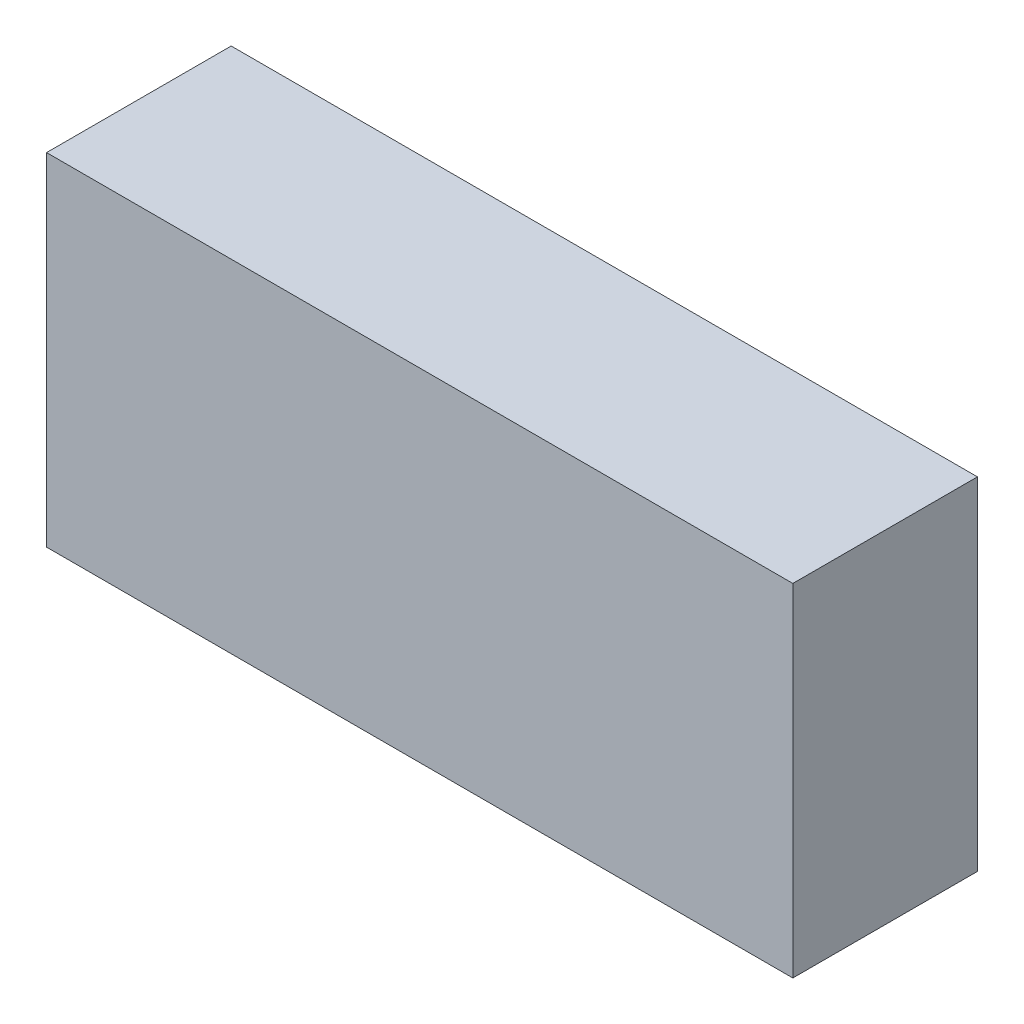
ISO-10303-21;
HEADER;
FILE_DESCRIPTION(('STEP AP214'),'2;1');
FILE_NAME('part.step','',(''),(''),'','','');
FILE_SCHEMA(('AUTOMOTIVE_DESIGN { 1 0 10303 214 1 1 1 1 }'));
ENDSEC;
DATA;
#1=APPLICATION_CONTEXT('core data for automotive mechanical design processes');
#2=APPLICATION_PROTOCOL_DEFINITION('international standard','automotive_design',2000,#1);
#3=PRODUCT_CONTEXT('',#1,'mechanical');
#4=PRODUCT('Part','Part','',(#3));
#5=PRODUCT_RELATED_PRODUCT_CATEGORY('part','',(#4));
#6=PRODUCT_DEFINITION_FORMATION('','',#4);
#7=PRODUCT_DEFINITION_CONTEXT('part definition',#1,'design');
#8=PRODUCT_DEFINITION('design','',#6,#7);
#9=PRODUCT_DEFINITION_SHAPE('','',#8);
#10=(LENGTH_UNIT() NAMED_UNIT(*) SI_UNIT(.MILLI.,.METRE.));
#11=(NAMED_UNIT(*) PLANE_ANGLE_UNIT() SI_UNIT($,.RADIAN.));
#12=(NAMED_UNIT(*) SI_UNIT($,.STERADIAN.) SOLID_ANGLE_UNIT());
#13=UNCERTAINTY_MEASURE_WITH_UNIT(LENGTH_MEASURE(1.E-05),#10,'distance_accuracy_value','');
#14=(GEOMETRIC_REPRESENTATION_CONTEXT(3) GLOBAL_UNCERTAINTY_ASSIGNED_CONTEXT((#13)) GLOBAL_UNIT_ASSIGNED_CONTEXT((#10,
#11,#12)) REPRESENTATION_CONTEXT('',''));
#15=CARTESIAN_POINT('',(0.,0.,0.));
#16=DIRECTION('',(0.,0.,1.));
#17=DIRECTION('',(1.,0.,0.));
#18=AXIS2_PLACEMENT_3D('',#15,#16,#17);
#19=CARTESIAN_POINT('',(47.5,43.5,-11.75));
#20=DIRECTION('',(-1.,0.,0.));
#21=DIRECTION('',(0.,0.,1.));
#22=AXIS2_PLACEMENT_3D('',#19,#20,#21);
#23=PLANE('',#22);
#24=DIRECTION('',(0.,0.,-1.));
#25=VECTOR('',#24,1.);
#26=CARTESIAN_POINT('',(47.5,0.,-11.75));
#27=LINE('',#26,#25);
#28=CARTESIAN_POINT('',(47.5,0.,11.75));
#29=VERTEX_POINT('',#28);
#30=CARTESIAN_POINT('',(47.5,0.,-11.75));
#31=VERTEX_POINT('',#30);
#32=EDGE_CURVE('E100',#29,#31,#27,.T.);
#33=ORIENTED_EDGE('',*,*,#32,.T.);
#34=DIRECTION('',(0.,-1.,0.));
#35=VECTOR('',#34,1.);
#36=CARTESIAN_POINT('',(47.5,43.5,-11.75));
#37=LINE('',#36,#35);
#38=CARTESIAN_POINT('',(47.5,43.5,-11.75));
#39=VERTEX_POINT('',#38);
#40=EDGE_CURVE('E11',#39,#31,#37,.T.);
#41=ORIENTED_EDGE('',*,*,#40,.F.);
#42=DIRECTION('',(0.,0.,-1.));
#43=VECTOR('',#42,1.);
#44=CARTESIAN_POINT('',(47.5,43.5,-11.75));
#45=LINE('',#44,#43);
#46=CARTESIAN_POINT('',(47.5,43.5,11.75));
#47=VERTEX_POINT('',#46);
#48=EDGE_CURVE('E88',#47,#39,#45,.T.);
#49=ORIENTED_EDGE('',*,*,#48,.F.);
#50=DIRECTION('',(0.,-1.,0.));
#51=VECTOR('',#50,1.);
#52=CARTESIAN_POINT('',(47.5,43.5,11.75));
#53=LINE('',#52,#51);
#54=EDGE_CURVE('E96',#47,#29,#53,.T.);
#55=ORIENTED_EDGE('',*,*,#54,.T.);
#56=EDGE_LOOP('',(#33,#41,#49,#55));
#57=FACE_BOUND('',#56,.T.);
#58=ADVANCED_FACE('F37',(#57),#23,.F.);
#59=CARTESIAN_POINT('',(-47.5,43.5,-11.75));
#60=DIRECTION('',(0.,0.,1.));
#61=DIRECTION('',(1.,0.,0.));
#62=AXIS2_PLACEMENT_3D('',#59,#60,#61);
#63=PLANE('',#62);
#64=DIRECTION('',(-1.,0.,0.));
#65=VECTOR('',#64,1.);
#66=CARTESIAN_POINT('',(-47.5,0.,-11.75));
#67=LINE('',#66,#65);
#68=CARTESIAN_POINT('',(-47.5,0.,-11.75));
#69=VERTEX_POINT('',#68);
#70=EDGE_CURVE('E92',#31,#69,#67,.T.);
#71=ORIENTED_EDGE('',*,*,#70,.T.);
#72=DIRECTION('',(0.,-1.,0.));
#73=VECTOR('',#72,1.);
#74=CARTESIAN_POINT('',(-47.5,43.5,-11.75));
#75=LINE('',#74,#73);
#76=CARTESIAN_POINT('',(-47.5,43.5,-11.75));
#77=VERTEX_POINT('',#76);
#78=EDGE_CURVE('E45',#77,#69,#75,.T.);
#79=ORIENTED_EDGE('',*,*,#78,.F.);
#80=DIRECTION('',(-1.,0.,0.));
#81=VECTOR('',#80,1.);
#82=CARTESIAN_POINT('',(-47.5,43.5,-11.75));
#83=LINE('',#82,#81);
#84=EDGE_CURVE('E83',#39,#77,#83,.T.);
#85=ORIENTED_EDGE('',*,*,#84,.F.);
#86=ORIENTED_EDGE('',*,*,#40,.T.);
#87=EDGE_LOOP('',(#71,#79,#85,#86));
#88=FACE_BOUND('',#87,.T.);
#89=ADVANCED_FACE('F91',(#88),#63,.F.);
#90=CARTESIAN_POINT('',(-47.5,43.5,-11.75));
#91=DIRECTION('',(1.,0.,0.));
#92=DIRECTION('',(0.,0.,-1.));
#93=AXIS2_PLACEMENT_3D('',#90,#91,#92);
#94=PLANE('',#93);
#95=DIRECTION('',(0.,0.,1.));
#96=VECTOR('',#95,1.);
#97=CARTESIAN_POINT('',(-47.5,0.,-11.75));
#98=LINE('',#97,#96);
#99=CARTESIAN_POINT('',(-47.5,0.,11.75));
#100=VERTEX_POINT('',#99);
#101=EDGE_CURVE('E70',#69,#100,#98,.T.);
#102=ORIENTED_EDGE('',*,*,#101,.T.);
#103=DIRECTION('',(0.,-1.,0.));
#104=VECTOR('',#103,1.);
#105=CARTESIAN_POINT('',(-47.5,43.5,11.75));
#106=LINE('',#105,#104);
#107=CARTESIAN_POINT('',(-47.5,43.5,11.75));
#108=VERTEX_POINT('',#107);
#109=EDGE_CURVE('E93',#108,#100,#106,.T.);
#110=ORIENTED_EDGE('',*,*,#109,.F.);
#111=DIRECTION('',(0.,0.,1.));
#112=VECTOR('',#111,1.);
#113=CARTESIAN_POINT('',(-47.5,43.5,-11.75));
#114=LINE('',#113,#112);
#115=EDGE_CURVE('E86',#77,#108,#114,.T.);
#116=ORIENTED_EDGE('',*,*,#115,.F.);
#117=ORIENTED_EDGE('',*,*,#78,.T.);
#118=EDGE_LOOP('',(#102,#110,#116,#117));
#119=FACE_BOUND('',#118,.T.);
#120=ADVANCED_FACE('F94',(#119),#94,.F.);
#121=CARTESIAN_POINT('',(-47.5,43.5,11.75));
#122=DIRECTION('',(0.,0.,-1.));
#123=DIRECTION('',(-1.,0.,0.));
#124=AXIS2_PLACEMENT_3D('',#121,#122,#123);
#125=PLANE('',#124);
#126=DIRECTION('',(1.,0.,0.));
#127=VECTOR('',#126,1.);
#128=CARTESIAN_POINT('',(-47.5,0.,11.75));
#129=LINE('',#128,#127);
#130=EDGE_CURVE('E76',#100,#29,#129,.T.);
#131=ORIENTED_EDGE('',*,*,#130,.T.);
#132=ORIENTED_EDGE('',*,*,#54,.F.);
#133=DIRECTION('',(1.,0.,0.));
#134=VECTOR('',#133,1.);
#135=CARTESIAN_POINT('',(-47.5,43.5,11.75));
#136=LINE('',#135,#134);
#137=EDGE_CURVE('E53',#108,#47,#136,.T.);
#138=ORIENTED_EDGE('',*,*,#137,.F.);
#139=ORIENTED_EDGE('',*,*,#109,.T.);
#140=EDGE_LOOP('',(#131,#132,#138,#139));
#141=FACE_BOUND('',#140,.T.);
#142=ADVANCED_FACE('F107',(#141),#125,.F.);
#143=CARTESIAN_POINT('',(0.,43.5,0.));
#144=DIRECTION('',(0.,1.,0.));
#145=DIRECTION('',(0.,0.,1.));
#146=AXIS2_PLACEMENT_3D('',#143,#144,#145);
#147=PLANE('',#146);
#148=ORIENTED_EDGE('',*,*,#48,.T.);
#149=ORIENTED_EDGE('',*,*,#84,.T.);
#150=ORIENTED_EDGE('',*,*,#115,.T.);
#151=ORIENTED_EDGE('',*,*,#137,.T.);
#152=EDGE_LOOP('',(#148,#149,#150,#151));
#153=FACE_BOUND('',#152,.T.);
#154=ADVANCED_FACE('F84',(#153),#147,.T.);
#155=CARTESIAN_POINT('',(0.,0.,0.));
#156=DIRECTION('',(0.,1.,0.));
#157=DIRECTION('',(0.,0.,1.));
#158=AXIS2_PLACEMENT_3D('',#155,#156,#157);
#159=PLANE('',#158);
#160=ORIENTED_EDGE('',*,*,#32,.F.);
#161=ORIENTED_EDGE('',*,*,#130,.F.);
#162=ORIENTED_EDGE('',*,*,#101,.F.);
#163=ORIENTED_EDGE('',*,*,#70,.F.);
#164=EDGE_LOOP('',(#160,#161,#162,#163));
#165=FACE_BOUND('',#164,.T.);
#166=ADVANCED_FACE('F110',(#165),#159,.F.);
#167=CLOSED_SHELL('',(#58,#89,#120,#142,#154,#166));
#168=MANIFOLD_SOLID_BREP('B2',#167);
#169=ADVANCED_BREP_SHAPE_REPRESENTATION('',(#18,#168),#14);
#170=SHAPE_DEFINITION_REPRESENTATION(#9,#169);
ENDSEC;
END-ISO-10303-21;
